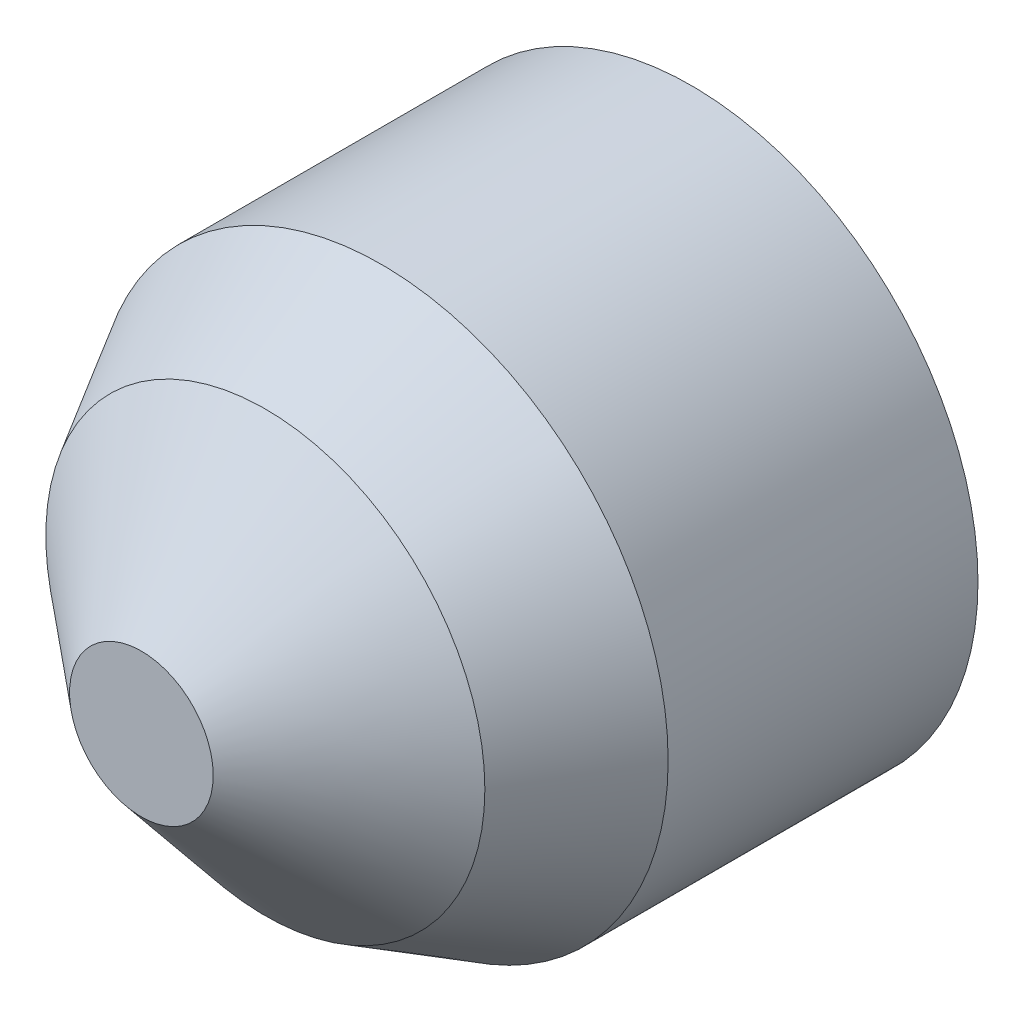
ISO-10303-21;
HEADER;
FILE_DESCRIPTION(('STEP AP214'),'2;1');
FILE_NAME('part.step','',(''),(''),'','','');
FILE_SCHEMA(('AUTOMOTIVE_DESIGN { 1 0 10303 214 1 1 1 1 }'));
ENDSEC;
DATA;
#1=APPLICATION_CONTEXT('core data for automotive mechanical design processes');
#2=APPLICATION_PROTOCOL_DEFINITION('international standard','automotive_design',2000,#1);
#3=PRODUCT_CONTEXT('',#1,'mechanical');
#4=PRODUCT('Part','Part','',(#3));
#5=PRODUCT_RELATED_PRODUCT_CATEGORY('part','',(#4));
#6=PRODUCT_DEFINITION_FORMATION('','',#4);
#7=PRODUCT_DEFINITION_CONTEXT('part definition',#1,'design');
#8=PRODUCT_DEFINITION('design','',#6,#7);
#9=PRODUCT_DEFINITION_SHAPE('','',#8);
#10=(LENGTH_UNIT() NAMED_UNIT(*) SI_UNIT(.MILLI.,.METRE.));
#11=(NAMED_UNIT(*) PLANE_ANGLE_UNIT() SI_UNIT($,.RADIAN.));
#12=(NAMED_UNIT(*) SI_UNIT($,.STERADIAN.) SOLID_ANGLE_UNIT());
#13=UNCERTAINTY_MEASURE_WITH_UNIT(LENGTH_MEASURE(1.E-05),#10,'distance_accuracy_value','');
#14=(GEOMETRIC_REPRESENTATION_CONTEXT(3) GLOBAL_UNCERTAINTY_ASSIGNED_CONTEXT((#13)) GLOBAL_UNIT_ASSIGNED_CONTEXT((#10,
#11,#12)) REPRESENTATION_CONTEXT('',''));
#15=CARTESIAN_POINT('',(0.,0.,0.));
#16=DIRECTION('',(0.,0.,1.));
#17=DIRECTION('',(1.,0.,0.));
#18=AXIS2_PLACEMENT_3D('',#15,#16,#17);
#19=CARTESIAN_POINT('',(0.,0.,8.));
#20=DIRECTION('',(0.,0.,-1.));
#21=DIRECTION('',(-1.,0.,0.));
#22=AXIS2_PLACEMENT_3D('',#19,#20,#21);
#23=CYLINDRICAL_SURFACE('',#22,7.4);
#24=CARTESIAN_POINT('',(0.,0.,8.));
#25=DIRECTION('',(0.,0.,1.));
#26=DIRECTION('',(1.,0.,0.));
#27=AXIS2_PLACEMENT_3D('',#24,#25,#26);
#28=CIRCLE('',#27,7.4);
#29=CARTESIAN_POINT('',(7.4,0.,8.));
#30=VERTEX_POINT('',#29);
#31=EDGE_CURVE('E10',#30,#30,#28,.T.);
#32=ORIENTED_EDGE('',*,*,#31,.F.);
#33=EDGE_LOOP('',(#32));
#34=FACE_BOUND('',#33,.T.);
#35=CARTESIAN_POINT('',(0.,0.,0.));
#36=DIRECTION('',(0.,0.,1.));
#37=DIRECTION('',(1.,0.,0.));
#38=AXIS2_PLACEMENT_3D('',#35,#36,#37);
#39=CIRCLE('',#38,7.4);
#40=CARTESIAN_POINT('',(7.4,0.,0.));
#41=VERTEX_POINT('',#40);
#42=EDGE_CURVE('E48',#41,#41,#39,.T.);
#43=ORIENTED_EDGE('',*,*,#42,.T.);
#44=EDGE_LOOP('',(#43));
#45=FACE_BOUND('',#44,.T.);
#46=ADVANCED_FACE('F41',(#34,#45),#23,.T.);
#47=CARTESIAN_POINT('',(0.,0.,0.));
#48=DIRECTION('',(0.,0.,1.));
#49=DIRECTION('',(1.,0.,0.));
#50=AXIS2_PLACEMENT_3D('',#47,#48,#49);
#51=PLANE('',#50);
#52=CARTESIAN_POINT('',(0.,0.,0.));
#53=DIRECTION('',(0.,0.,1.));
#54=DIRECTION('',(1.,0.,0.));
#55=AXIS2_PLACEMENT_3D('',#52,#53,#54);
#56=CIRCLE('',#55,2.6);
#57=CARTESIAN_POINT('',(2.6,0.,0.));
#58=VERTEX_POINT('',#57);
#59=EDGE_CURVE('E42',#58,#58,#56,.T.);
#60=ORIENTED_EDGE('',*,*,#59,.T.);
#61=EDGE_LOOP('',(#60));
#62=FACE_BOUND('',#61,.T.);
#63=ORIENTED_EDGE('',*,*,#42,.F.);
#64=EDGE_LOOP('',(#63));
#65=FACE_BOUND('',#64,.T.);
#66=ADVANCED_FACE('F69',(#62,#65),#51,.F.);
#67=CARTESIAN_POINT('',(0.,0.,8.));
#68=DIRECTION('',(0.,0.,-1.));
#69=DIRECTION('',(1.,0.,0.));
#70=AXIS2_PLACEMENT_3D('',#67,#68,#69);
#71=CONICAL_SURFACE('',#70,7.4,0.523598775598299);
#72=CARTESIAN_POINT('',(0.,0.,11.));
#73=DIRECTION('',(0.,0.,1.));
#74=DIRECTION('',(1.,0.,0.));
#75=AXIS2_PLACEMENT_3D('',#72,#73,#74);
#76=CIRCLE('',#75,5.66794919243112);
#77=CARTESIAN_POINT('',(5.66794919243112,0.,11.));
#78=VERTEX_POINT('',#77);
#79=EDGE_CURVE('E52',#78,#78,#76,.T.);
#80=ORIENTED_EDGE('',*,*,#79,.F.);
#81=EDGE_LOOP('',(#80));
#82=FACE_BOUND('',#81,.T.);
#83=ORIENTED_EDGE('',*,*,#31,.T.);
#84=EDGE_LOOP('',(#83));
#85=FACE_BOUND('',#84,.T.);
#86=ADVANCED_FACE('F89',(#82,#85),#71,.T.);
#87=CARTESIAN_POINT('',(0.,0.,11.));
#88=DIRECTION('',(0.,0.,-1.));
#89=DIRECTION('',(1.,0.,0.));
#90=AXIS2_PLACEMENT_3D('',#87,#88,#89);
#91=CONICAL_SURFACE('',#90,5.66794919243112,0.872664625997165);
#92=CARTESIAN_POINT('',(0.,0.,14.2));
#93=DIRECTION('',(0.,0.,1.));
#94=DIRECTION('',(1.,0.,0.));
#95=AXIS2_PLACEMENT_3D('',#92,#93,#94);
#96=CIRCLE('',#95,1.85433769612965);
#97=CARTESIAN_POINT('',(1.85433769612965,0.,14.2));
#98=VERTEX_POINT('',#97);
#99=EDGE_CURVE('E60',#98,#98,#96,.T.);
#100=CARTESIAN_POINT('',(1.85433769612965,0.,14.2));
#101=CARTESIAN_POINT('',(1.89406281588279,0.,14.1666666666667));
#102=CARTESIAN_POINT('',(1.93378793563593,0.,14.1333333333333));
#103=CARTESIAN_POINT('',(2.01323817514221,0.,14.0666666666667));
#104=CARTESIAN_POINT('',(2.05296329489536,0.,14.0333333333333));
#105=CARTESIAN_POINT('',(2.13241353440164,0.,13.9666666666667));
#106=CARTESIAN_POINT('',(2.17213865415478,0.,13.9333333333333));
#107=CARTESIAN_POINT('',(2.25158889366106,0.,13.8666666666667));
#108=CARTESIAN_POINT('',(2.2913140134142,0.,13.8333333333333));
#109=CARTESIAN_POINT('',(2.37076425292048,0.,13.7666666666667));
#110=CARTESIAN_POINT('',(2.41048937267362,0.,13.7333333333333));
#111=CARTESIAN_POINT('',(2.4899396121799,0.,13.6666666666667));
#112=CARTESIAN_POINT('',(2.52966473193304,0.,13.6333333333333));
#113=CARTESIAN_POINT('',(2.60911497143932,0.,13.5666666666667));
#114=CARTESIAN_POINT('',(2.64884009119246,0.,13.5333333333333));
#115=CARTESIAN_POINT('',(2.72829033069874,0.,13.4666666666667));
#116=CARTESIAN_POINT('',(2.76801545045188,0.,13.4333333333333));
#117=CARTESIAN_POINT('',(2.84746568995816,0.,13.3666666666667));
#118=CARTESIAN_POINT('',(2.8871908097113,0.,13.3333333333333));
#119=CARTESIAN_POINT('',(2.96664104921758,0.,13.2666666666667));
#120=CARTESIAN_POINT('',(3.00636616897072,0.,13.2333333333333));
#121=CARTESIAN_POINT('',(3.085816408477,0.,13.1666666666667));
#122=CARTESIAN_POINT('',(3.12554152823014,0.,13.1333333333333));
#123=CARTESIAN_POINT('',(3.20499176773642,0.,13.0666666666667));
#124=CARTESIAN_POINT('',(3.24471688748956,0.,13.0333333333333));
#125=CARTESIAN_POINT('',(3.32416712699585,0.,12.9666666666667));
#126=CARTESIAN_POINT('',(3.36389224674899,0.,12.9333333333333));
#127=CARTESIAN_POINT('',(3.44334248625527,0.,12.8666666666667));
#128=CARTESIAN_POINT('',(3.48306760600841,0.,12.8333333333333));
#129=CARTESIAN_POINT('',(3.56251784551469,0.,12.7666666666667));
#130=CARTESIAN_POINT('',(3.60224296526783,0.,12.7333333333333));
#131=CARTESIAN_POINT('',(3.68169320477411,0.,12.6666666666667));
#132=CARTESIAN_POINT('',(3.72141832452725,0.,12.6333333333333));
#133=CARTESIAN_POINT('',(3.80086856403353,0.,12.5666666666667));
#134=CARTESIAN_POINT('',(3.84059368378667,0.,12.5333333333333));
#135=CARTESIAN_POINT('',(3.92004392329295,0.,12.4666666666667));
#136=CARTESIAN_POINT('',(3.95976904304609,0.,12.4333333333333));
#137=CARTESIAN_POINT('',(4.03921928255237,0.,12.3666666666667));
#138=CARTESIAN_POINT('',(4.07894440230551,0.,12.3333333333333));
#139=CARTESIAN_POINT('',(4.15839464181179,0.,12.2666666666667));
#140=CARTESIAN_POINT('',(4.19811976156493,0.,12.2333333333333));
#141=CARTESIAN_POINT('',(4.27757000107121,0.,12.1666666666667));
#142=CARTESIAN_POINT('',(4.31729512082435,0.,12.1333333333333));
#143=CARTESIAN_POINT('',(4.39674536033063,0.,12.0666666666667));
#144=CARTESIAN_POINT('',(4.43647048008377,0.,12.0333333333333));
#145=CARTESIAN_POINT('',(4.51592071959006,0.,11.9666666666667));
#146=CARTESIAN_POINT('',(4.5556458393432,0.,11.9333333333333));
#147=CARTESIAN_POINT('',(4.63509607884948,0.,11.8666666666667));
#148=CARTESIAN_POINT('',(4.67482119860262,0.,11.8333333333333));
#149=CARTESIAN_POINT('',(4.7542714381089,0.,11.7666666666667));
#150=CARTESIAN_POINT('',(4.79399655786204,0.,11.7333333333333));
#151=CARTESIAN_POINT('',(4.87344679736832,0.,11.6666666666667));
#152=CARTESIAN_POINT('',(4.91317191712146,0.,11.6333333333333));
#153=CARTESIAN_POINT('',(4.99262215662774,0.,11.5666666666667));
#154=CARTESIAN_POINT('',(5.03234727638088,0.,11.5333333333333));
#155=CARTESIAN_POINT('',(5.11179751588716,0.,11.4666666666667));
#156=CARTESIAN_POINT('',(5.1515226356403,0.,11.4333333333333));
#157=CARTESIAN_POINT('',(5.23097287514658,0.,11.3666666666667));
#158=CARTESIAN_POINT('',(5.27069799489972,0.,11.3333333333333));
#159=CARTESIAN_POINT('',(5.350148234406,0.,11.2666666666667));
#160=CARTESIAN_POINT('',(5.38987335415914,0.,11.2333333333333));
#161=CARTESIAN_POINT('',(5.46932359366542,0.,11.1666666666667));
#162=CARTESIAN_POINT('',(5.50904871341856,0.,11.1333333333333));
#163=CARTESIAN_POINT('',(5.58849895292484,0.,11.0666666666667));
#164=CARTESIAN_POINT('',(5.62822407267798,0.,11.0333333333333));
#165=CARTESIAN_POINT('',(5.66794919243112,0.,11.));
#166=B_SPLINE_CURVE_WITH_KNOTS('',3,(#100,#101,#102,#103,#104,#105,#106,#107,#108,#109,#110,
#111,#112,#113,#114,#115,#116,#117,#118,#119,#120,#121,#122,#123,#124,#125,#126,#127,#128,#129,
#130,#131,#132,#133,#134,#135,#136,#137,#138,#139,#140,#141,#142,#143,#144,#145,#146,#147,#148,
#149,#150,#151,#152,#153,#154,#155,#156,#157,#158,#159,#160,#161,#162,#163,#164,#165),
.UNSPECIFIED.,.F.,.F.,(4,2,2,2,2,2,2,2,2,2,2,2,2,2,2,2,2,2,2,2,2,2,2,2,2,2,2,2,2,2,2,2,4),(0.,
0.15557238268604,0.311144765372082,0.466717148058122,0.622289530744164,0.777861913430205,
0.933434296116247,1.08900667880229,1.24457906148833,1.40015144417437,1.55572382686041,
1.71129620954645,1.86686859223249,2.02244097491854,2.17801335760458,2.33358574029062,
2.48915812297666,2.6447305056627,2.80030288834874,2.95587527103478,3.11144765372082,
3.26702003640686,3.42259241909291,3.57816480177895,3.73373718446499,3.88930956715103,
4.04488194983707,4.20045433252311,4.35602671520915,4.51159909789519,4.66717148058123,
4.82274386326728,4.97831624595332),.UNSPECIFIED.);
#167=EDGE_CURVE('BSEAM84',#98,#78,#166,.T.);
#168=ORIENTED_EDGE('',*,*,#99,.F.);
#169=ORIENTED_EDGE('',*,*,#79,.T.);
#170=ORIENTED_EDGE('',*,*,#167,.T.);
#171=ORIENTED_EDGE('',*,*,#167,.F.);
#172=EDGE_LOOP('',(#168,#170,#169,#171));
#173=FACE_BOUND('',#172,.T.);
#174=ADVANCED_FACE('F84',(#173),#91,.T.);
#175=CARTESIAN_POINT('',(0.,0.,14.2));
#176=DIRECTION('',(0.,0.,1.));
#177=DIRECTION('',(1.,0.,0.));
#178=AXIS2_PLACEMENT_3D('',#175,#176,#177);
#179=PLANE('',#178);
#180=ORIENTED_EDGE('',*,*,#99,.T.);
#181=EDGE_LOOP('',(#180));
#182=FACE_BOUND('',#181,.T.);
#183=ADVANCED_FACE('F71',(#182),#179,.T.);
#184=CARTESIAN_POINT('',(0.,0.,-0.499999999999999));
#185=DIRECTION('',(0.,0.,1.));
#186=DIRECTION('',(1.,0.,0.));
#187=AXIS2_PLACEMENT_3D('',#184,#185,#186);
#188=CYLINDRICAL_SURFACE('',#187,2.6);
#189=CARTESIAN_POINT('',(0.,0.,9.));
#190=DIRECTION('',(0.,0.,1.));
#191=DIRECTION('',(1.,0.,0.));
#192=AXIS2_PLACEMENT_3D('',#189,#190,#191);
#193=CIRCLE('',#192,2.6);
#194=CARTESIAN_POINT('',(2.6,0.,9.));
#195=VERTEX_POINT('',#194);
#196=EDGE_CURVE('E58',#195,#195,#193,.T.);
#197=ORIENTED_EDGE('',*,*,#196,.T.);
#198=EDGE_LOOP('',(#197));
#199=FACE_BOUND('',#198,.T.);
#200=ORIENTED_EDGE('',*,*,#59,.F.);
#201=EDGE_LOOP('',(#200));
#202=FACE_BOUND('',#201,.T.);
#203=ADVANCED_FACE('F66',(#199,#202),#188,.F.);
#204=CARTESIAN_POINT('',(0.,0.,9.));
#205=DIRECTION('',(0.,0.,1.));
#206=DIRECTION('',(1.,0.,0.));
#207=AXIS2_PLACEMENT_3D('',#204,#205,#206);
#208=PLANE('',#207);
#209=ORIENTED_EDGE('',*,*,#196,.F.);
#210=EDGE_LOOP('',(#209));
#211=FACE_BOUND('',#210,.T.);
#212=ADVANCED_FACE('F75',(#211),#208,.F.);
#213=CLOSED_SHELL('',(#46,#66,#86,#174,#183,#203,#212));
#214=MANIFOLD_SOLID_BREP('B2',#213);
#215=ADVANCED_BREP_SHAPE_REPRESENTATION('',(#18,#214),#14);
#216=SHAPE_DEFINITION_REPRESENTATION(#9,#215);
ENDSEC;
END-ISO-10303-21;
